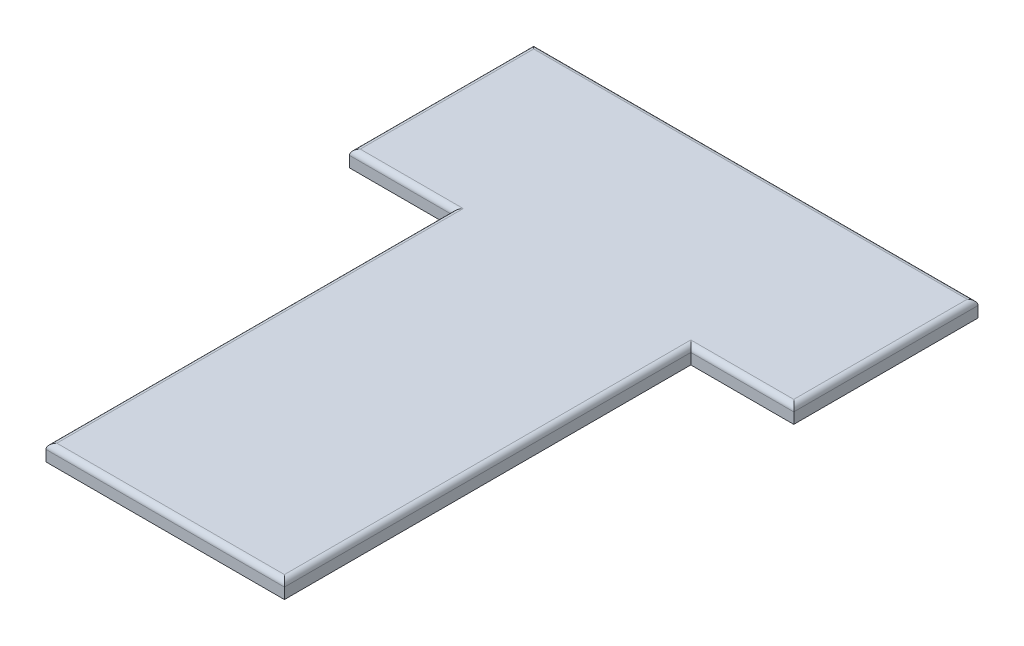
ISO-10303-21;
HEADER;
FILE_DESCRIPTION(('STEP AP214'),'2;1');
FILE_NAME('part.step','',(''),(''),'','','');
FILE_SCHEMA(('AUTOMOTIVE_DESIGN { 1 0 10303 214 1 1 1 1 }'));
ENDSEC;
DATA;
#1=APPLICATION_CONTEXT('core data for automotive mechanical design processes');
#2=APPLICATION_PROTOCOL_DEFINITION('international standard','automotive_design',2000,#1);
#3=PRODUCT_CONTEXT('',#1,'mechanical');
#4=PRODUCT('Part','Part','',(#3));
#5=PRODUCT_RELATED_PRODUCT_CATEGORY('part','',(#4));
#6=PRODUCT_DEFINITION_FORMATION('','',#4);
#7=PRODUCT_DEFINITION_CONTEXT('part definition',#1,'design');
#8=PRODUCT_DEFINITION('design','',#6,#7);
#9=PRODUCT_DEFINITION_SHAPE('','',#8);
#10=(LENGTH_UNIT() NAMED_UNIT(*) SI_UNIT(.MILLI.,.METRE.));
#11=(NAMED_UNIT(*) PLANE_ANGLE_UNIT() SI_UNIT($,.RADIAN.));
#12=(NAMED_UNIT(*) SI_UNIT($,.STERADIAN.) SOLID_ANGLE_UNIT());
#13=UNCERTAINTY_MEASURE_WITH_UNIT(LENGTH_MEASURE(1.E-05),#10,'distance_accuracy_value','');
#14=(GEOMETRIC_REPRESENTATION_CONTEXT(3) GLOBAL_UNCERTAINTY_ASSIGNED_CONTEXT((#13)) GLOBAL_UNIT_ASSIGNED_CONTEXT((#10,
#11,#12)) REPRESENTATION_CONTEXT('',''));
#15=CARTESIAN_POINT('',(0.,0.,0.));
#16=DIRECTION('',(0.,0.,1.));
#17=DIRECTION('',(1.,0.,0.));
#18=AXIS2_PLACEMENT_3D('',#15,#16,#17);
#19=CARTESIAN_POINT('',(63.,3.,0.));
#20=DIRECTION('',(0.,0.,-1.));
#21=DIRECTION('',(-1.,0.,0.));
#22=AXIS2_PLACEMENT_3D('',#19,#20,#21);
#23=PLANE('',#22);
#24=DIRECTION('',(0.,-1.,0.));
#25=VECTOR('',#24,1.);
#26=CARTESIAN_POINT('',(63.,3.,0.));
#27=LINE('',#26,#25);
#28=CARTESIAN_POINT('',(63.,2.,0.));
#29=VERTEX_POINT('',#28);
#30=CARTESIAN_POINT('',(63.,0.,0.));
#31=VERTEX_POINT('',#30);
#32=EDGE_CURVE('E123',#29,#31,#27,.T.);
#33=ORIENTED_EDGE('',*,*,#32,.F.);
#34=DIRECTION('',(1.,0.,0.));
#35=VECTOR('',#34,1.);
#36=CARTESIAN_POINT('',(63.,2.,0.));
#37=LINE('',#36,#35);
#38=CARTESIAN_POINT('',(19.,2.,0.));
#39=VERTEX_POINT('',#38);
#40=EDGE_CURVE('E203',#29,#39,#37,.F.);
#41=ORIENTED_EDGE('',*,*,#40,.T.);
#42=DIRECTION('',(0.,-1.,0.));
#43=VECTOR('',#42,1.);
#44=CARTESIAN_POINT('',(19.,3.,0.));
#45=LINE('',#44,#43);
#46=CARTESIAN_POINT('',(19.,0.,0.));
#47=VERTEX_POINT('',#46);
#48=EDGE_CURVE('E146',#39,#47,#45,.T.);
#49=ORIENTED_EDGE('',*,*,#48,.T.);
#50=DIRECTION('',(1.,0.,0.));
#51=VECTOR('',#50,1.);
#52=CARTESIAN_POINT('',(63.,0.,0.));
#53=LINE('',#52,#51);
#54=EDGE_CURVE('E141',#47,#31,#53,.T.);
#55=ORIENTED_EDGE('',*,*,#54,.T.);
#56=EDGE_LOOP('',(#33,#41,#49,#55));
#57=FACE_BOUND('',#56,.T.);
#58=ADVANCED_FACE('F33',(#57),#23,.F.);
#59=CARTESIAN_POINT('',(63.,3.,-75.));
#60=DIRECTION('',(-1.,0.,0.));
#61=DIRECTION('',(0.,0.,1.));
#62=AXIS2_PLACEMENT_3D('',#59,#60,#61);
#63=PLANE('',#62);
#64=DIRECTION('',(0.,-1.,0.));
#65=VECTOR('',#64,1.);
#66=CARTESIAN_POINT('',(63.,3.,-75.));
#67=LINE('',#66,#65);
#68=CARTESIAN_POINT('',(63.,2.,-75.));
#69=VERTEX_POINT('',#68);
#70=CARTESIAN_POINT('',(63.,0.,-75.));
#71=VERTEX_POINT('',#70);
#72=EDGE_CURVE('E135',#69,#71,#67,.T.);
#73=ORIENTED_EDGE('',*,*,#72,.F.);
#74=DIRECTION('',(0.,0.,-1.));
#75=VECTOR('',#74,1.);
#76=CARTESIAN_POINT('',(63.,2.,-75.));
#77=LINE('',#76,#75);
#78=EDGE_CURVE('E130',#69,#29,#77,.F.);
#79=ORIENTED_EDGE('',*,*,#78,.T.);
#80=ORIENTED_EDGE('',*,*,#32,.T.);
#81=DIRECTION('',(0.,0.,-1.));
#82=VECTOR('',#81,1.);
#83=CARTESIAN_POINT('',(63.,0.,-75.));
#84=LINE('',#83,#82);
#85=EDGE_CURVE('E127',#31,#71,#84,.T.);
#86=ORIENTED_EDGE('',*,*,#85,.T.);
#87=EDGE_LOOP('',(#73,#79,#80,#86));
#88=FACE_BOUND('',#87,.T.);
#89=ADVANCED_FACE('F126',(#88),#63,.F.);
#90=CARTESIAN_POINT('',(82.,3.,-75.));
#91=DIRECTION('',(0.,0.,-1.));
#92=DIRECTION('',(-1.,0.,0.));
#93=AXIS2_PLACEMENT_3D('',#90,#91,#92);
#94=PLANE('',#93);
#95=DIRECTION('',(0.,-1.,0.));
#96=VECTOR('',#95,1.);
#97=CARTESIAN_POINT('',(82.,3.,-75.));
#98=LINE('',#97,#96);
#99=CARTESIAN_POINT('',(82.,2.,-75.));
#100=VERTEX_POINT('',#99);
#101=CARTESIAN_POINT('',(82.,0.,-75.));
#102=VERTEX_POINT('',#101);
#103=EDGE_CURVE('E176',#100,#102,#98,.T.);
#104=ORIENTED_EDGE('',*,*,#103,.F.);
#105=DIRECTION('',(1.,0.,0.));
#106=VECTOR('',#105,1.);
#107=CARTESIAN_POINT('',(82.,2.,-75.));
#108=LINE('',#107,#106);
#109=EDGE_CURVE('E200',#100,#69,#108,.F.);
#110=ORIENTED_EDGE('',*,*,#109,.T.);
#111=ORIENTED_EDGE('',*,*,#72,.T.);
#112=DIRECTION('',(1.,0.,0.));
#113=VECTOR('',#112,1.);
#114=CARTESIAN_POINT('',(82.,0.,-75.));
#115=LINE('',#114,#113);
#116=EDGE_CURVE('E144',#71,#102,#115,.T.);
#117=ORIENTED_EDGE('',*,*,#116,.T.);
#118=EDGE_LOOP('',(#104,#110,#111,#117));
#119=FACE_BOUND('',#118,.T.);
#120=ADVANCED_FACE('F267',(#119),#94,.F.);
#121=CARTESIAN_POINT('',(82.,3.,-109.));
#122=DIRECTION('',(-1.,0.,0.));
#123=DIRECTION('',(0.,0.,1.));
#124=AXIS2_PLACEMENT_3D('',#121,#122,#123);
#125=PLANE('',#124);
#126=DIRECTION('',(0.,-1.,0.));
#127=VECTOR('',#126,1.);
#128=CARTESIAN_POINT('',(82.,3.,-109.));
#129=LINE('',#128,#127);
#130=CARTESIAN_POINT('',(82.,2.,-109.));
#131=VERTEX_POINT('',#130);
#132=CARTESIAN_POINT('',(82.,0.,-109.));
#133=VERTEX_POINT('',#132);
#134=EDGE_CURVE('E174',#131,#133,#129,.T.);
#135=ORIENTED_EDGE('',*,*,#134,.F.);
#136=DIRECTION('',(0.,0.,-1.));
#137=VECTOR('',#136,1.);
#138=CARTESIAN_POINT('',(82.,2.,-109.));
#139=LINE('',#138,#137);
#140=EDGE_CURVE('E198',#131,#100,#139,.F.);
#141=ORIENTED_EDGE('',*,*,#140,.T.);
#142=ORIENTED_EDGE('',*,*,#103,.T.);
#143=DIRECTION('',(0.,0.,-1.));
#144=VECTOR('',#143,1.);
#145=CARTESIAN_POINT('',(82.,0.,-109.));
#146=LINE('',#145,#144);
#147=EDGE_CURVE('E153',#102,#133,#146,.T.);
#148=ORIENTED_EDGE('',*,*,#147,.T.);
#149=EDGE_LOOP('',(#135,#141,#142,#148));
#150=FACE_BOUND('',#149,.T.);
#151=ADVANCED_FACE('F264',(#150),#125,.F.);
#152=CARTESIAN_POINT('',(0.,3.,-109.));
#153=DIRECTION('',(0.,0.,1.));
#154=DIRECTION('',(1.,0.,0.));
#155=AXIS2_PLACEMENT_3D('',#152,#153,#154);
#156=PLANE('',#155);
#157=DIRECTION('',(0.,-1.,0.));
#158=VECTOR('',#157,1.);
#159=CARTESIAN_POINT('',(0.,3.,-109.));
#160=LINE('',#159,#158);
#161=CARTESIAN_POINT('',(0.,2.,-109.));
#162=VERTEX_POINT('',#161);
#163=CARTESIAN_POINT('',(0.,0.,-109.));
#164=VERTEX_POINT('',#163);
#165=EDGE_CURVE('E172',#162,#164,#160,.T.);
#166=ORIENTED_EDGE('',*,*,#165,.F.);
#167=DIRECTION('',(-1.,0.,0.));
#168=VECTOR('',#167,1.);
#169=CARTESIAN_POINT('',(0.,2.,-109.));
#170=LINE('',#169,#168);
#171=EDGE_CURVE('E195',#162,#131,#170,.F.);
#172=ORIENTED_EDGE('',*,*,#171,.T.);
#173=ORIENTED_EDGE('',*,*,#134,.T.);
#174=DIRECTION('',(-1.,0.,0.));
#175=VECTOR('',#174,1.);
#176=CARTESIAN_POINT('',(0.,0.,-109.));
#177=LINE('',#176,#175);
#178=EDGE_CURVE('E156',#133,#164,#177,.T.);
#179=ORIENTED_EDGE('',*,*,#178,.T.);
#180=EDGE_LOOP('',(#166,#172,#173,#179));
#181=FACE_BOUND('',#180,.T.);
#182=ADVANCED_FACE('F249',(#181),#156,.F.);
#183=CARTESIAN_POINT('',(0.,3.,-75.));
#184=DIRECTION('',(1.,0.,0.));
#185=DIRECTION('',(0.,0.,-1.));
#186=AXIS2_PLACEMENT_3D('',#183,#184,#185);
#187=PLANE('',#186);
#188=DIRECTION('',(0.,-1.,0.));
#189=VECTOR('',#188,1.);
#190=CARTESIAN_POINT('',(0.,3.,-75.));
#191=LINE('',#190,#189);
#192=CARTESIAN_POINT('',(0.,2.,-75.));
#193=VERTEX_POINT('',#192);
#194=CARTESIAN_POINT('',(0.,0.,-75.));
#195=VERTEX_POINT('',#194);
#196=EDGE_CURVE('E170',#193,#195,#191,.T.);
#197=ORIENTED_EDGE('',*,*,#196,.F.);
#198=DIRECTION('',(0.,0.,1.));
#199=VECTOR('',#198,1.);
#200=CARTESIAN_POINT('',(0.,2.,-75.));
#201=LINE('',#200,#199);
#202=EDGE_CURVE('E11',#193,#162,#201,.F.);
#203=ORIENTED_EDGE('',*,*,#202,.T.);
#204=ORIENTED_EDGE('',*,*,#165,.T.);
#205=DIRECTION('',(0.,0.,1.));
#206=VECTOR('',#205,1.);
#207=CARTESIAN_POINT('',(0.,0.,-75.));
#208=LINE('',#207,#206);
#209=EDGE_CURVE('E159',#164,#195,#208,.T.);
#210=ORIENTED_EDGE('',*,*,#209,.T.);
#211=EDGE_LOOP('',(#197,#203,#204,#210));
#212=FACE_BOUND('',#211,.T.);
#213=ADVANCED_FACE('F246',(#212),#187,.F.);
#214=CARTESIAN_POINT('',(19.,3.,-75.));
#215=DIRECTION('',(0.,0.,-1.));
#216=DIRECTION('',(-1.,0.,0.));
#217=AXIS2_PLACEMENT_3D('',#214,#215,#216);
#218=PLANE('',#217);
#219=DIRECTION('',(0.,-1.,0.));
#220=VECTOR('',#219,1.);
#221=CARTESIAN_POINT('',(19.,3.,-75.));
#222=LINE('',#221,#220);
#223=CARTESIAN_POINT('',(19.,2.,-75.));
#224=VERTEX_POINT('',#223);
#225=CARTESIAN_POINT('',(19.,0.,-75.));
#226=VERTEX_POINT('',#225);
#227=EDGE_CURVE('E168',#224,#226,#222,.T.);
#228=ORIENTED_EDGE('',*,*,#227,.F.);
#229=DIRECTION('',(1.,0.,0.));
#230=VECTOR('',#229,1.);
#231=CARTESIAN_POINT('',(19.,2.,-75.));
#232=LINE('',#231,#230);
#233=EDGE_CURVE('E42',#224,#193,#232,.F.);
#234=ORIENTED_EDGE('',*,*,#233,.T.);
#235=ORIENTED_EDGE('',*,*,#196,.T.);
#236=DIRECTION('',(1.,0.,0.));
#237=VECTOR('',#236,1.);
#238=CARTESIAN_POINT('',(19.,0.,-75.));
#239=LINE('',#238,#237);
#240=EDGE_CURVE('E162',#195,#226,#239,.T.);
#241=ORIENTED_EDGE('',*,*,#240,.T.);
#242=EDGE_LOOP('',(#228,#234,#235,#241));
#243=FACE_BOUND('',#242,.T.);
#244=ADVANCED_FACE('F362',(#243),#218,.F.);
#245=CARTESIAN_POINT('',(19.,3.,0.));
#246=DIRECTION('',(1.,0.,0.));
#247=DIRECTION('',(0.,0.,-1.));
#248=AXIS2_PLACEMENT_3D('',#245,#246,#247);
#249=PLANE('',#248);
#250=ORIENTED_EDGE('',*,*,#48,.F.);
#251=DIRECTION('',(0.,0.,1.));
#252=VECTOR('',#251,1.);
#253=CARTESIAN_POINT('',(19.,2.,0.));
#254=LINE('',#253,#252);
#255=EDGE_CURVE('E57',#39,#224,#254,.F.);
#256=ORIENTED_EDGE('',*,*,#255,.T.);
#257=ORIENTED_EDGE('',*,*,#227,.T.);
#258=DIRECTION('',(0.,0.,1.));
#259=VECTOR('',#258,1.);
#260=CARTESIAN_POINT('',(19.,0.,0.));
#261=LINE('',#260,#259);
#262=EDGE_CURVE('E165',#226,#47,#261,.T.);
#263=ORIENTED_EDGE('',*,*,#262,.T.);
#264=EDGE_LOOP('',(#250,#256,#257,#263));
#265=FACE_BOUND('',#264,.T.);
#266=ADVANCED_FACE('F354',(#265),#249,.F.);
#267=CARTESIAN_POINT('',(0.,3.,0.));
#268=DIRECTION('',(0.,-1.,0.));
#269=DIRECTION('',(0.,0.,-1.));
#270=AXIS2_PLACEMENT_3D('',#267,#268,#269);
#271=PLANE('',#270);
#272=DIRECTION('',(0.,0.,-1.));
#273=VECTOR('',#272,1.);
#274=CARTESIAN_POINT('',(81.,3.,0.));
#275=LINE('',#274,#273);
#276=CARTESIAN_POINT('',(81.,3.,-76.));
#277=VERTEX_POINT('',#276);
#278=CARTESIAN_POINT('',(81.,3.,-108.));
#279=VERTEX_POINT('',#278);
#280=EDGE_CURVE('E190',#277,#279,#275,.T.);
#281=ORIENTED_EDGE('',*,*,#280,.T.);
#282=DIRECTION('',(-1.,0.,0.));
#283=VECTOR('',#282,1.);
#284=CARTESIAN_POINT('',(0.,3.,-108.));
#285=LINE('',#284,#283);
#286=CARTESIAN_POINT('',(1.,3.,-108.));
#287=VERTEX_POINT('',#286);
#288=EDGE_CURVE('E192',#279,#287,#285,.T.);
#289=ORIENTED_EDGE('',*,*,#288,.T.);
#290=DIRECTION('',(0.,0.,1.));
#291=VECTOR('',#290,1.);
#292=CARTESIAN_POINT('',(1.,3.,0.));
#293=LINE('',#292,#291);
#294=CARTESIAN_POINT('',(1.,3.,-76.));
#295=VERTEX_POINT('',#294);
#296=EDGE_CURVE('E134',#287,#295,#293,.T.);
#297=ORIENTED_EDGE('',*,*,#296,.T.);
#298=DIRECTION('',(1.,0.,0.));
#299=VECTOR('',#298,1.);
#300=CARTESIAN_POINT('',(0.,3.,-76.));
#301=LINE('',#300,#299);
#302=CARTESIAN_POINT('',(20.,3.,-76.));
#303=VERTEX_POINT('',#302);
#304=EDGE_CURVE('E180',#295,#303,#301,.T.);
#305=ORIENTED_EDGE('',*,*,#304,.T.);
#306=DIRECTION('',(0.,0.,1.));
#307=VECTOR('',#306,1.);
#308=CARTESIAN_POINT('',(20.,3.,0.));
#309=LINE('',#308,#307);
#310=CARTESIAN_POINT('',(20.,3.,-0.999999999999995));
#311=VERTEX_POINT('',#310);
#312=EDGE_CURVE('E182',#303,#311,#309,.T.);
#313=ORIENTED_EDGE('',*,*,#312,.T.);
#314=DIRECTION('',(1.,0.,0.));
#315=VECTOR('',#314,1.);
#316=CARTESIAN_POINT('',(0.,3.,-0.999999999999992));
#317=LINE('',#316,#315);
#318=CARTESIAN_POINT('',(62.,3.,-1.));
#319=VERTEX_POINT('',#318);
#320=EDGE_CURVE('E184',#311,#319,#317,.T.);
#321=ORIENTED_EDGE('',*,*,#320,.T.);
#322=DIRECTION('',(0.,0.,-1.));
#323=VECTOR('',#322,1.);
#324=CARTESIAN_POINT('',(62.,3.,0.));
#325=LINE('',#324,#323);
#326=CARTESIAN_POINT('',(62.,3.,-76.));
#327=VERTEX_POINT('',#326);
#328=EDGE_CURVE('E186',#319,#327,#325,.T.);
#329=ORIENTED_EDGE('',*,*,#328,.T.);
#330=DIRECTION('',(1.,0.,0.));
#331=VECTOR('',#330,1.);
#332=CARTESIAN_POINT('',(0.,3.,-76.));
#333=LINE('',#332,#331);
#334=EDGE_CURVE('E188',#327,#277,#333,.T.);
#335=ORIENTED_EDGE('',*,*,#334,.T.);
#336=EDGE_LOOP('',(#281,#289,#297,#305,#313,#321,#329,#335));
#337=FACE_BOUND('',#336,.T.);
#338=ADVANCED_FACE('F233',(#337),#271,.F.);
#339=CARTESIAN_POINT('',(0.,0.,0.));
#340=DIRECTION('',(0.,-1.,0.));
#341=DIRECTION('',(0.,0.,-1.));
#342=AXIS2_PLACEMENT_3D('',#339,#340,#341);
#343=PLANE('',#342);
#344=ORIENTED_EDGE('',*,*,#54,.F.);
#345=ORIENTED_EDGE('',*,*,#262,.F.);
#346=ORIENTED_EDGE('',*,*,#240,.F.);
#347=ORIENTED_EDGE('',*,*,#209,.F.);
#348=ORIENTED_EDGE('',*,*,#178,.F.);
#349=ORIENTED_EDGE('',*,*,#147,.F.);
#350=ORIENTED_EDGE('',*,*,#116,.F.);
#351=ORIENTED_EDGE('',*,*,#85,.F.);
#352=EDGE_LOOP('',(#344,#345,#346,#347,#348,#349,#350,#351));
#353=FACE_BOUND('',#352,.T.);
#354=ADVANCED_FACE('F139',(#353),#343,.T.);
#355=CARTESIAN_POINT('',(0.,2.,-0.999999999999992));
#356=DIRECTION('',(1.,0.,0.));
#357=DIRECTION('',(0.,0.,-1.));
#358=AXIS2_PLACEMENT_3D('',#355,#356,#357);
#359=CYLINDRICAL_SURFACE('',#358,1.);
#360=CARTESIAN_POINT('',(20.,2.,-0.999999999999995));
#361=DIRECTION('',(0.707106781186548,0.,0.707106781186547));
#362=DIRECTION('',(-0.707106781186547,0.,0.707106781186548));
#363=AXIS2_PLACEMENT_3D('',#360,#361,#362);
#364=ELLIPSE('',#363,1.4142135623731,1.);
#365=EDGE_CURVE('E150',#39,#311,#364,.F.);
#366=ORIENTED_EDGE('',*,*,#365,.F.);
#367=ORIENTED_EDGE('',*,*,#40,.F.);
#368=CARTESIAN_POINT('',(62.,2.,-1.));
#369=DIRECTION('',(0.707106781186547,0.,-0.707106781186548));
#370=DIRECTION('',(0.707106781186548,0.,0.707106781186547));
#371=AXIS2_PLACEMENT_3D('',#368,#369,#370);
#372=ELLIPSE('',#371,1.4142135623731,1.);
#373=EDGE_CURVE('E37',#319,#29,#372,.T.);
#374=ORIENTED_EDGE('',*,*,#373,.F.);
#375=ORIENTED_EDGE('',*,*,#320,.F.);
#376=EDGE_LOOP('',(#366,#367,#374,#375));
#377=FACE_BOUND('',#376,.T.);
#378=ADVANCED_FACE('F35',(#377),#359,.T.);
#379=CARTESIAN_POINT('',(62.,2.,0.));
#380=DIRECTION('',(0.,0.,-1.));
#381=DIRECTION('',(-1.,0.,0.));
#382=AXIS2_PLACEMENT_3D('',#379,#380,#381);
#383=CYLINDRICAL_SURFACE('',#382,1.);
#384=ORIENTED_EDGE('',*,*,#373,.T.);
#385=ORIENTED_EDGE('',*,*,#78,.F.);
#386=CARTESIAN_POINT('',(62.,2.,-76.));
#387=DIRECTION('',(0.707106781186547,0.,-0.707106781186548));
#388=DIRECTION('',(0.707106781186548,0.,0.707106781186547));
#389=AXIS2_PLACEMENT_3D('',#386,#387,#388);
#390=ELLIPSE('',#389,1.4142135623731,1.);
#391=EDGE_CURVE('E220',#327,#69,#390,.T.);
#392=ORIENTED_EDGE('',*,*,#391,.F.);
#393=ORIENTED_EDGE('',*,*,#328,.F.);
#394=EDGE_LOOP('',(#384,#385,#392,#393));
#395=FACE_BOUND('',#394,.T.);
#396=ADVANCED_FACE('F272',(#395),#383,.T.);
#397=CARTESIAN_POINT('',(20.,2.,0.));
#398=DIRECTION('',(0.,0.,1.));
#399=DIRECTION('',(1.,0.,0.));
#400=AXIS2_PLACEMENT_3D('',#397,#398,#399);
#401=CYLINDRICAL_SURFACE('',#400,1.);
#402=ORIENTED_EDGE('',*,*,#365,.T.);
#403=ORIENTED_EDGE('',*,*,#312,.F.);
#404=CARTESIAN_POINT('',(20.,2.,-76.));
#405=DIRECTION('',(0.707106781186547,0.,0.707106781186548));
#406=DIRECTION('',(-0.707106781186548,0.,0.707106781186547));
#407=AXIS2_PLACEMENT_3D('',#404,#405,#406);
#408=ELLIPSE('',#407,1.41421356237309,1.);
#409=EDGE_CURVE('E217',#224,#303,#408,.F.);
#410=ORIENTED_EDGE('',*,*,#409,.F.);
#411=ORIENTED_EDGE('',*,*,#255,.F.);
#412=EDGE_LOOP('',(#402,#403,#410,#411));
#413=FACE_BOUND('',#412,.T.);
#414=ADVANCED_FACE('F226',(#413),#401,.T.);
#415=CARTESIAN_POINT('',(0.,2.,-76.));
#416=DIRECTION('',(1.,0.,0.));
#417=DIRECTION('',(0.,0.,-1.));
#418=AXIS2_PLACEMENT_3D('',#415,#416,#417);
#419=CYLINDRICAL_SURFACE('',#418,1.);
#420=ORIENTED_EDGE('',*,*,#391,.T.);
#421=ORIENTED_EDGE('',*,*,#109,.F.);
#422=CARTESIAN_POINT('',(81.,2.,-76.));
#423=DIRECTION('',(0.707106781186547,0.,-0.707106781186547));
#424=DIRECTION('',(0.707106781186547,0.,0.707106781186547));
#425=AXIS2_PLACEMENT_3D('',#422,#423,#424);
#426=ELLIPSE('',#425,1.41421356237309,1.);
#427=EDGE_CURVE('E214',#277,#100,#426,.T.);
#428=ORIENTED_EDGE('',*,*,#427,.F.);
#429=ORIENTED_EDGE('',*,*,#334,.F.);
#430=EDGE_LOOP('',(#420,#421,#428,#429));
#431=FACE_BOUND('',#430,.T.);
#432=ADVANCED_FACE('F269',(#431),#419,.T.);
#433=CARTESIAN_POINT('',(0.,2.,-76.));
#434=DIRECTION('',(1.,0.,0.));
#435=DIRECTION('',(0.,0.,-1.));
#436=AXIS2_PLACEMENT_3D('',#433,#434,#435);
#437=CYLINDRICAL_SURFACE('',#436,1.);
#438=ORIENTED_EDGE('',*,*,#409,.T.);
#439=ORIENTED_EDGE('',*,*,#304,.F.);
#440=CARTESIAN_POINT('',(1.,2.,-76.));
#441=DIRECTION('',(0.707106781186547,0.,0.707106781186548));
#442=DIRECTION('',(-0.707106781186548,0.,0.707106781186547));
#443=AXIS2_PLACEMENT_3D('',#440,#441,#442);
#444=ELLIPSE('',#443,1.41421356237309,1.);
#445=EDGE_CURVE('E211',#193,#295,#444,.F.);
#446=ORIENTED_EDGE('',*,*,#445,.F.);
#447=ORIENTED_EDGE('',*,*,#233,.F.);
#448=EDGE_LOOP('',(#438,#439,#446,#447));
#449=FACE_BOUND('',#448,.T.);
#450=ADVANCED_FACE('F239',(#449),#437,.T.);
#451=CARTESIAN_POINT('',(81.,2.,0.));
#452=DIRECTION('',(0.,0.,-1.));
#453=DIRECTION('',(-1.,0.,0.));
#454=AXIS2_PLACEMENT_3D('',#451,#452,#453);
#455=CYLINDRICAL_SURFACE('',#454,1.);
#456=ORIENTED_EDGE('',*,*,#427,.T.);
#457=ORIENTED_EDGE('',*,*,#140,.F.);
#458=CARTESIAN_POINT('',(81.,2.,-108.));
#459=DIRECTION('',(-0.707106781186548,0.,-0.707106781186547));
#460=DIRECTION('',(0.707106781186547,0.,-0.707106781186548));
#461=AXIS2_PLACEMENT_3D('',#458,#459,#460);
#462=ELLIPSE('',#461,1.4142135623731,1.);
#463=EDGE_CURVE('E209',#279,#131,#462,.T.);
#464=ORIENTED_EDGE('',*,*,#463,.F.);
#465=ORIENTED_EDGE('',*,*,#280,.F.);
#466=EDGE_LOOP('',(#456,#457,#464,#465));
#467=FACE_BOUND('',#466,.T.);
#468=ADVANCED_FACE('F260',(#467),#455,.T.);
#469=CARTESIAN_POINT('',(1.,2.,0.));
#470=DIRECTION('',(0.,0.,1.));
#471=DIRECTION('',(1.,0.,0.));
#472=AXIS2_PLACEMENT_3D('',#469,#470,#471);
#473=CYLINDRICAL_SURFACE('',#472,1.);
#474=ORIENTED_EDGE('',*,*,#445,.T.);
#475=ORIENTED_EDGE('',*,*,#296,.F.);
#476=CARTESIAN_POINT('',(1.,2.,-108.));
#477=DIRECTION('',(-0.707106781186547,0.,0.707106781186548));
#478=DIRECTION('',(0.707106781186548,0.,0.707106781186547));
#479=AXIS2_PLACEMENT_3D('',#476,#477,#478);
#480=ELLIPSE('',#479,1.41421356237309,1.);
#481=EDGE_CURVE('E207',#162,#287,#480,.F.);
#482=ORIENTED_EDGE('',*,*,#481,.F.);
#483=ORIENTED_EDGE('',*,*,#202,.F.);
#484=EDGE_LOOP('',(#474,#475,#482,#483));
#485=FACE_BOUND('',#484,.T.);
#486=ADVANCED_FACE('F242',(#485),#473,.T.);
#487=CARTESIAN_POINT('',(0.,2.,-108.));
#488=DIRECTION('',(-1.,0.,0.));
#489=DIRECTION('',(0.,0.,1.));
#490=AXIS2_PLACEMENT_3D('',#487,#488,#489);
#491=CYLINDRICAL_SURFACE('',#490,1.);
#492=ORIENTED_EDGE('',*,*,#463,.T.);
#493=ORIENTED_EDGE('',*,*,#171,.F.);
#494=ORIENTED_EDGE('',*,*,#481,.T.);
#495=ORIENTED_EDGE('',*,*,#288,.F.);
#496=EDGE_LOOP('',(#492,#493,#494,#495));
#497=FACE_BOUND('',#496,.T.);
#498=ADVANCED_FACE('F254',(#497),#491,.T.);
#499=CLOSED_SHELL('',(#58,#89,#120,#151,#182,#213,#244,#266,#338,#354,#378,#396,#414,#432,#450,
#468,#486,#498));
#500=MANIFOLD_SOLID_BREP('B2',#499);
#501=ADVANCED_BREP_SHAPE_REPRESENTATION('',(#18,#500),#14);
#502=SHAPE_DEFINITION_REPRESENTATION(#9,#501);
ENDSEC;
END-ISO-10303-21;
